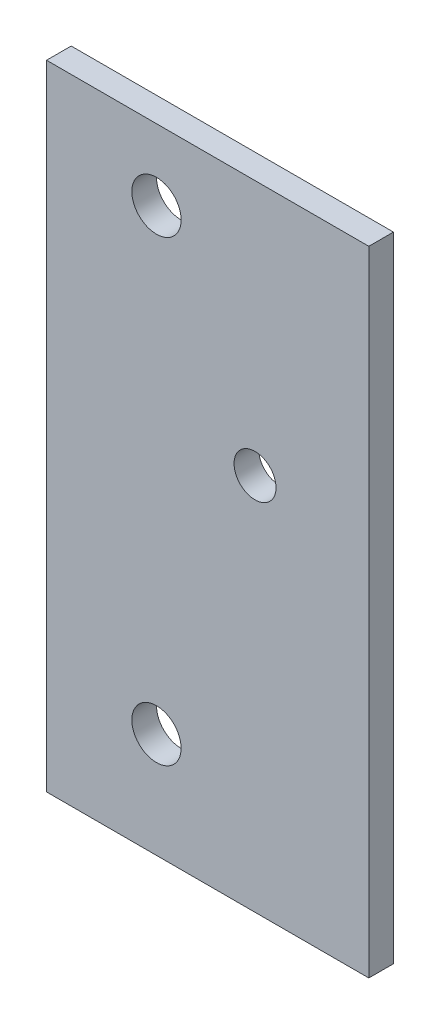
ISO-10303-21;
HEADER;
FILE_DESCRIPTION(('STEP AP214'),'2;1');
FILE_NAME('part.step','',(''),(''),'','','');
FILE_SCHEMA(('AUTOMOTIVE_DESIGN { 1 0 10303 214 1 1 1 1 }'));
ENDSEC;
DATA;
#1=APPLICATION_CONTEXT('core data for automotive mechanical design processes');
#2=APPLICATION_PROTOCOL_DEFINITION('international standard','automotive_design',2000,#1);
#3=PRODUCT_CONTEXT('',#1,'mechanical');
#4=PRODUCT('Part','Part','',(#3));
#5=PRODUCT_RELATED_PRODUCT_CATEGORY('part','',(#4));
#6=PRODUCT_DEFINITION_FORMATION('','',#4);
#7=PRODUCT_DEFINITION_CONTEXT('part definition',#1,'design');
#8=PRODUCT_DEFINITION('design','',#6,#7);
#9=PRODUCT_DEFINITION_SHAPE('','',#8);
#10=(LENGTH_UNIT() NAMED_UNIT(*) SI_UNIT(.MILLI.,.METRE.));
#11=(NAMED_UNIT(*) PLANE_ANGLE_UNIT() SI_UNIT($,.RADIAN.));
#12=(NAMED_UNIT(*) SI_UNIT($,.STERADIAN.) SOLID_ANGLE_UNIT());
#13=UNCERTAINTY_MEASURE_WITH_UNIT(LENGTH_MEASURE(1.E-05),#10,'distance_accuracy_value','');
#14=(GEOMETRIC_REPRESENTATION_CONTEXT(3) GLOBAL_UNCERTAINTY_ASSIGNED_CONTEXT((#13)) GLOBAL_UNIT_ASSIGNED_CONTEXT((#10,
#11,#12)) REPRESENTATION_CONTEXT('',''));
#15=CARTESIAN_POINT('',(0.,0.,0.));
#16=DIRECTION('',(0.,0.,1.));
#17=DIRECTION('',(1.,0.,0.));
#18=AXIS2_PLACEMENT_3D('',#15,#16,#17);
#19=CARTESIAN_POINT('',(0.,0.,3.175));
#20=DIRECTION('',(0.,0.,-1.));
#21=DIRECTION('',(-1.,0.,0.));
#22=AXIS2_PLACEMENT_3D('',#19,#20,#21);
#23=PLANE('',#22);
#24=CARTESIAN_POINT('',(-63.4999999999998,-200.66,3.175));
#25=DIRECTION('',(0.,0.,1.));
#26=DIRECTION('',(1.,0.,0.));
#27=AXIS2_PLACEMENT_3D('',#24,#25,#26);
#28=CIRCLE('',#27,2.70509999999999);
#29=CARTESIAN_POINT('',(-60.7948999999998,-200.66,3.175));
#30=VERTEX_POINT('',#29);
#31=EDGE_CURVE('E132',#30,#30,#28,.T.);
#32=ORIENTED_EDGE('',*,*,#31,.F.);
#33=EDGE_LOOP('',(#32));
#34=FACE_BOUND('',#33,.T.);
#35=DIRECTION('',(0.,-1.,0.));
#36=VECTOR('',#35,1.);
#37=CARTESIAN_POINT('',(-90.3649480967701,-249.391771877871,3.175));
#38=LINE('',#37,#36);
#39=CARTESIAN_POINT('',(-90.3649480967701,-167.734857538772,3.175));
#40=VERTEX_POINT('',#39);
#41=CARTESIAN_POINT('',(-90.3649480967701,-249.391771877871,3.175));
#42=VERTEX_POINT('',#41);
#43=EDGE_CURVE('E91',#40,#42,#38,.T.);
#44=ORIENTED_EDGE('',*,*,#43,.T.);
#45=DIRECTION('',(1.,0.,0.));
#46=VECTOR('',#45,1.);
#47=CARTESIAN_POINT('',(-90.3649480967701,-249.391771877871,3.175));
#48=LINE('',#47,#46);
#49=CARTESIAN_POINT('',(-48.8383866996429,-249.391771877871,3.175));
#50=VERTEX_POINT('',#49);
#51=EDGE_CURVE('E86',#42,#50,#48,.T.);
#52=ORIENTED_EDGE('',*,*,#51,.T.);
#53=DIRECTION('',(0.,1.,0.));
#54=VECTOR('',#53,1.);
#55=CARTESIAN_POINT('',(-48.8383866996429,-249.391771877871,3.175));
#56=LINE('',#55,#54);
#57=CARTESIAN_POINT('',(-48.8383866996429,-167.734857538772,3.175));
#58=VERTEX_POINT('',#57);
#59=EDGE_CURVE('E89',#50,#58,#56,.T.);
#60=ORIENTED_EDGE('',*,*,#59,.T.);
#61=DIRECTION('',(-1.,0.,0.));
#62=VECTOR('',#61,1.);
#63=CARTESIAN_POINT('',(-90.3649480967701,-167.734857538772,3.175));
#64=LINE('',#63,#62);
#65=EDGE_CURVE('E56',#58,#40,#64,.T.);
#66=ORIENTED_EDGE('',*,*,#65,.T.);
#67=EDGE_LOOP('',(#44,#52,#60,#66));
#68=FACE_BOUND('',#67,.T.);
#69=CARTESIAN_POINT('',(-76.1999999999994,-176.892857142857,3.175));
#70=DIRECTION('',(0.,0.,1.));
#71=DIRECTION('',(1.,0.,0.));
#72=AXIS2_PLACEMENT_3D('',#69,#70,#71);
#73=CIRCLE('',#72,3.175);
#74=CARTESIAN_POINT('',(-73.0249999999994,-176.892857142857,3.175));
#75=VERTEX_POINT('',#74);
#76=EDGE_CURVE('E106',#75,#75,#73,.T.);
#77=ORIENTED_EDGE('',*,*,#76,.F.);
#78=EDGE_LOOP('',(#77));
#79=FACE_BOUND('',#78,.T.);
#80=CARTESIAN_POINT('',(-76.1999999999992,-235.857142857143,3.175));
#81=DIRECTION('',(0.,0.,1.));
#82=DIRECTION('',(1.,0.,0.));
#83=AXIS2_PLACEMENT_3D('',#80,#81,#82);
#84=CIRCLE('',#83,3.17499999999998);
#85=CARTESIAN_POINT('',(-73.0249999999992,-235.857142857143,3.175));
#86=VERTEX_POINT('',#85);
#87=EDGE_CURVE('E121',#86,#86,#84,.T.);
#88=ORIENTED_EDGE('',*,*,#87,.F.);
#89=EDGE_LOOP('',(#88));
#90=FACE_BOUND('',#89,.T.);
#91=ADVANCED_FACE('F39',(#34,#68,#79,#90),#23,.F.);
#92=CARTESIAN_POINT('',(0.,0.,0.));
#93=DIRECTION('',(0.,0.,-1.));
#94=DIRECTION('',(-1.,0.,0.));
#95=AXIS2_PLACEMENT_3D('',#92,#93,#94);
#96=PLANE('',#95);
#97=CARTESIAN_POINT('',(-63.4999999999998,-200.66,0.));
#98=DIRECTION('',(0.,0.,1.));
#99=DIRECTION('',(1.,0.,0.));
#100=AXIS2_PLACEMENT_3D('',#97,#98,#99);
#101=CIRCLE('',#100,2.7051);
#102=CARTESIAN_POINT('',(-60.7948999999998,-200.66,0.));
#103=VERTEX_POINT('',#102);
#104=EDGE_CURVE('E127',#103,#103,#101,.T.);
#105=ORIENTED_EDGE('',*,*,#104,.T.);
#106=EDGE_LOOP('',(#105));
#107=FACE_BOUND('',#106,.T.);
#108=CARTESIAN_POINT('',(-76.1999999999994,-176.892857142857,0.));
#109=DIRECTION('',(0.,0.,1.));
#110=DIRECTION('',(1.,0.,0.));
#111=AXIS2_PLACEMENT_3D('',#108,#109,#110);
#112=CIRCLE('',#111,3.175);
#113=CARTESIAN_POINT('',(-73.0249999999994,-176.892857142857,0.));
#114=VERTEX_POINT('',#113);
#115=EDGE_CURVE('E118',#114,#114,#112,.T.);
#116=ORIENTED_EDGE('',*,*,#115,.T.);
#117=EDGE_LOOP('',(#116));
#118=FACE_BOUND('',#117,.T.);
#119=DIRECTION('',(0.,-1.,0.));
#120=VECTOR('',#119,1.);
#121=CARTESIAN_POINT('',(-90.3649480967701,-249.391771877871,0.));
#122=LINE('',#121,#120);
#123=CARTESIAN_POINT('',(-90.3649480967701,-167.734857538772,0.));
#124=VERTEX_POINT('',#123);
#125=CARTESIAN_POINT('',(-90.3649480967701,-249.391771877871,0.));
#126=VERTEX_POINT('',#125);
#127=EDGE_CURVE('E103',#124,#126,#122,.T.);
#128=ORIENTED_EDGE('',*,*,#127,.F.);
#129=DIRECTION('',(-1.,0.,0.));
#130=VECTOR('',#129,1.);
#131=CARTESIAN_POINT('',(-90.3649480967701,-167.734857538772,0.));
#132=LINE('',#131,#130);
#133=CARTESIAN_POINT('',(-48.8383866996429,-167.734857538772,0.));
#134=VERTEX_POINT('',#133);
#135=EDGE_CURVE('E79',#134,#124,#132,.T.);
#136=ORIENTED_EDGE('',*,*,#135,.F.);
#137=DIRECTION('',(0.,1.,0.));
#138=VECTOR('',#137,1.);
#139=CARTESIAN_POINT('',(-48.8383866996429,-249.391771877871,0.));
#140=LINE('',#139,#138);
#141=CARTESIAN_POINT('',(-48.8383866996429,-249.391771877871,0.));
#142=VERTEX_POINT('',#141);
#143=EDGE_CURVE('E73',#142,#134,#140,.T.);
#144=ORIENTED_EDGE('',*,*,#143,.F.);
#145=DIRECTION('',(1.,0.,0.));
#146=VECTOR('',#145,1.);
#147=CARTESIAN_POINT('',(-90.3649480967701,-249.391771877871,0.));
#148=LINE('',#147,#146);
#149=EDGE_CURVE('E95',#126,#142,#148,.T.);
#150=ORIENTED_EDGE('',*,*,#149,.F.);
#151=EDGE_LOOP('',(#128,#136,#144,#150));
#152=FACE_BOUND('',#151,.T.);
#153=CARTESIAN_POINT('',(-76.1999999999992,-235.857142857143,0.));
#154=DIRECTION('',(0.,0.,1.));
#155=DIRECTION('',(1.,0.,0.));
#156=AXIS2_PLACEMENT_3D('',#153,#154,#155);
#157=CIRCLE('',#156,3.17499999999998);
#158=CARTESIAN_POINT('',(-73.0249999999992,-235.857142857143,0.));
#159=VERTEX_POINT('',#158);
#160=EDGE_CURVE('E124',#159,#159,#157,.T.);
#161=ORIENTED_EDGE('',*,*,#160,.T.);
#162=EDGE_LOOP('',(#161));
#163=FACE_BOUND('',#162,.T.);
#164=ADVANCED_FACE('F114',(#107,#118,#152,#163),#96,.T.);
#165=CARTESIAN_POINT('',(-90.3649480967701,-249.391771877871,3.175));
#166=DIRECTION('',(1.,0.,0.));
#167=DIRECTION('',(0.,0.,-1.));
#168=AXIS2_PLACEMENT_3D('',#165,#166,#167);
#169=PLANE('',#168);
#170=ORIENTED_EDGE('',*,*,#127,.T.);
#171=DIRECTION('',(0.,0.,-1.));
#172=VECTOR('',#171,1.);
#173=CARTESIAN_POINT('',(-90.3649480967701,-249.391771877871,3.175));
#174=LINE('',#173,#172);
#175=EDGE_CURVE('E11',#42,#126,#174,.T.);
#176=ORIENTED_EDGE('',*,*,#175,.F.);
#177=ORIENTED_EDGE('',*,*,#43,.F.);
#178=DIRECTION('',(0.,0.,-1.));
#179=VECTOR('',#178,1.);
#180=CARTESIAN_POINT('',(-90.3649480967701,-167.734857538772,3.175));
#181=LINE('',#180,#179);
#182=EDGE_CURVE('E99',#40,#124,#181,.T.);
#183=ORIENTED_EDGE('',*,*,#182,.T.);
#184=EDGE_LOOP('',(#170,#176,#177,#183));
#185=FACE_BOUND('',#184,.T.);
#186=ADVANCED_FACE('F41',(#185),#169,.F.);
#187=CARTESIAN_POINT('',(-90.3649480967701,-249.391771877871,3.175));
#188=DIRECTION('',(0.,1.,0.));
#189=DIRECTION('',(0.,0.,1.));
#190=AXIS2_PLACEMENT_3D('',#187,#188,#189);
#191=PLANE('',#190);
#192=ORIENTED_EDGE('',*,*,#149,.T.);
#193=DIRECTION('',(0.,0.,-1.));
#194=VECTOR('',#193,1.);
#195=CARTESIAN_POINT('',(-48.8383866996429,-249.391771877871,3.175));
#196=LINE('',#195,#194);
#197=EDGE_CURVE('E48',#50,#142,#196,.T.);
#198=ORIENTED_EDGE('',*,*,#197,.F.);
#199=ORIENTED_EDGE('',*,*,#51,.F.);
#200=ORIENTED_EDGE('',*,*,#175,.T.);
#201=EDGE_LOOP('',(#192,#198,#199,#200));
#202=FACE_BOUND('',#201,.T.);
#203=ADVANCED_FACE('F94',(#202),#191,.F.);
#204=CARTESIAN_POINT('',(-48.8383866996429,-249.391771877871,3.175));
#205=DIRECTION('',(-1.,0.,0.));
#206=DIRECTION('',(0.,0.,1.));
#207=AXIS2_PLACEMENT_3D('',#204,#205,#206);
#208=PLANE('',#207);
#209=ORIENTED_EDGE('',*,*,#143,.T.);
#210=DIRECTION('',(0.,0.,-1.));
#211=VECTOR('',#210,1.);
#212=CARTESIAN_POINT('',(-48.8383866996429,-167.734857538772,3.175));
#213=LINE('',#212,#211);
#214=EDGE_CURVE('E96',#58,#134,#213,.T.);
#215=ORIENTED_EDGE('',*,*,#214,.F.);
#216=ORIENTED_EDGE('',*,*,#59,.F.);
#217=ORIENTED_EDGE('',*,*,#197,.T.);
#218=EDGE_LOOP('',(#209,#215,#216,#217));
#219=FACE_BOUND('',#218,.T.);
#220=ADVANCED_FACE('F97',(#219),#208,.F.);
#221=CARTESIAN_POINT('',(-90.3649480967701,-167.734857538772,3.175));
#222=DIRECTION('',(0.,-1.,0.));
#223=DIRECTION('',(0.,0.,-1.));
#224=AXIS2_PLACEMENT_3D('',#221,#222,#223);
#225=PLANE('',#224);
#226=ORIENTED_EDGE('',*,*,#135,.T.);
#227=ORIENTED_EDGE('',*,*,#182,.F.);
#228=ORIENTED_EDGE('',*,*,#65,.F.);
#229=ORIENTED_EDGE('',*,*,#214,.T.);
#230=EDGE_LOOP('',(#226,#227,#228,#229));
#231=FACE_BOUND('',#230,.T.);
#232=ADVANCED_FACE('F111',(#231),#225,.F.);
#233=CARTESIAN_POINT('',(-76.1999999999994,-176.892857142857,3.175));
#234=DIRECTION('',(0.,0.,-1.));
#235=DIRECTION('',(-1.,0.,0.));
#236=AXIS2_PLACEMENT_3D('',#233,#234,#235);
#237=CYLINDRICAL_SURFACE('',#236,3.175);
#238=ORIENTED_EDGE('',*,*,#76,.T.);
#239=EDGE_LOOP('',(#238));
#240=FACE_BOUND('',#239,.T.);
#241=ORIENTED_EDGE('',*,*,#115,.F.);
#242=EDGE_LOOP('',(#241));
#243=FACE_BOUND('',#242,.T.);
#244=ADVANCED_FACE('F147',(#240,#243),#237,.F.);
#245=CARTESIAN_POINT('',(-76.1999999999992,-235.857142857143,3.175));
#246=DIRECTION('',(0.,0.,-1.));
#247=DIRECTION('',(-1.,0.,0.));
#248=AXIS2_PLACEMENT_3D('',#245,#246,#247);
#249=CYLINDRICAL_SURFACE('',#248,3.17499999999998);
#250=ORIENTED_EDGE('',*,*,#87,.T.);
#251=EDGE_LOOP('',(#250));
#252=FACE_BOUND('',#251,.T.);
#253=ORIENTED_EDGE('',*,*,#160,.F.);
#254=EDGE_LOOP('',(#253));
#255=FACE_BOUND('',#254,.T.);
#256=ADVANCED_FACE('F189',(#252,#255),#249,.F.);
#257=CARTESIAN_POINT('',(-63.4999999999998,-200.66,3.175));
#258=DIRECTION('',(0.,0.,1.));
#259=DIRECTION('',(1.,0.,0.));
#260=AXIS2_PLACEMENT_3D('',#257,#258,#259);
#261=CYLINDRICAL_SURFACE('',#260,2.70509999999999);
#262=ORIENTED_EDGE('',*,*,#104,.F.);
#263=EDGE_LOOP('',(#262));
#264=FACE_BOUND('',#263,.T.);
#265=ORIENTED_EDGE('',*,*,#31,.T.);
#266=EDGE_LOOP('',(#265));
#267=FACE_BOUND('',#266,.T.);
#268=ADVANCED_FACE('F136',(#264,#267),#261,.F.);
#269=CLOSED_SHELL('',(#91,#164,#186,#203,#220,#232,#244,#256,#268));
#270=MANIFOLD_SOLID_BREP('B2',#269);
#271=ADVANCED_BREP_SHAPE_REPRESENTATION('',(#18,#270),#14);
#272=SHAPE_DEFINITION_REPRESENTATION(#9,#271);
ENDSEC;
END-ISO-10303-21;
